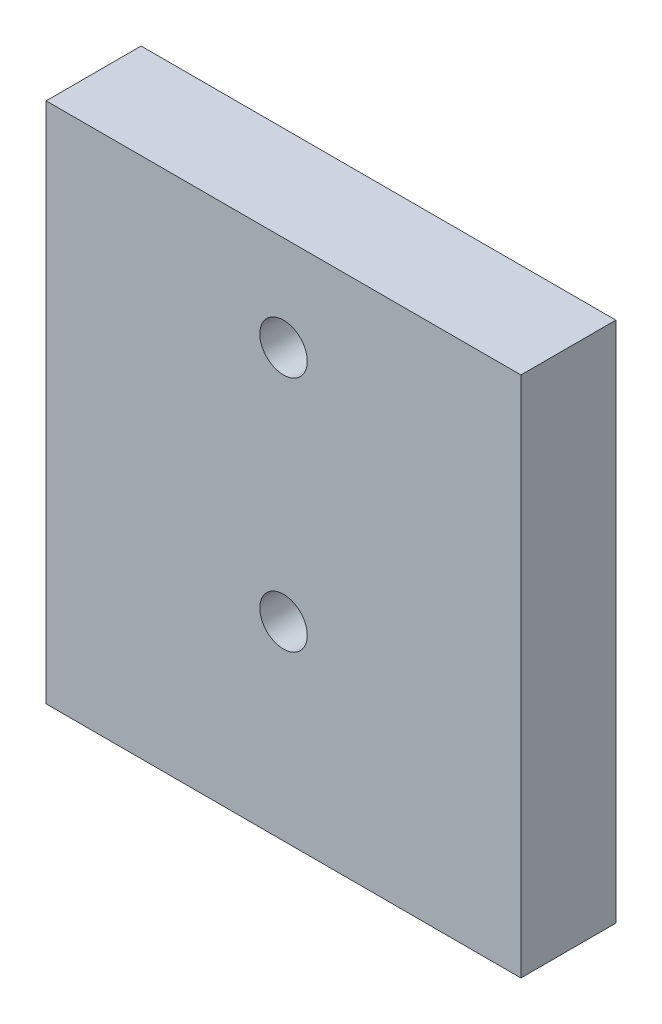
ISO-10303-21;
HEADER;
FILE_DESCRIPTION(('STEP AP214'),'2;1');
FILE_NAME('part.step','',(''),(''),'','','');
FILE_SCHEMA(('AUTOMOTIVE_DESIGN { 1 0 10303 214 1 1 1 1 }'));
ENDSEC;
DATA;
#1=APPLICATION_CONTEXT('core data for automotive mechanical design processes');
#2=APPLICATION_PROTOCOL_DEFINITION('international standard','automotive_design',2000,#1);
#3=PRODUCT_CONTEXT('',#1,'mechanical');
#4=PRODUCT('Part','Part','',(#3));
#5=PRODUCT_RELATED_PRODUCT_CATEGORY('part','',(#4));
#6=PRODUCT_DEFINITION_FORMATION('','',#4);
#7=PRODUCT_DEFINITION_CONTEXT('part definition',#1,'design');
#8=PRODUCT_DEFINITION('design','',#6,#7);
#9=PRODUCT_DEFINITION_SHAPE('','',#8);
#10=(LENGTH_UNIT() NAMED_UNIT(*) SI_UNIT(.MILLI.,.METRE.));
#11=(NAMED_UNIT(*) PLANE_ANGLE_UNIT() SI_UNIT($,.RADIAN.));
#12=(NAMED_UNIT(*) SI_UNIT($,.STERADIAN.) SOLID_ANGLE_UNIT());
#13=UNCERTAINTY_MEASURE_WITH_UNIT(LENGTH_MEASURE(1.E-05),#10,'distance_accuracy_value','');
#14=(GEOMETRIC_REPRESENTATION_CONTEXT(3) GLOBAL_UNCERTAINTY_ASSIGNED_CONTEXT((#13)) GLOBAL_UNIT_ASSIGNED_CONTEXT((#10,
#11,#12)) REPRESENTATION_CONTEXT('',''));
#15=CARTESIAN_POINT('',(0.,0.,0.));
#16=DIRECTION('',(0.,0.,1.));
#17=DIRECTION('',(1.,0.,0.));
#18=AXIS2_PLACEMENT_3D('',#15,#16,#17);
#19=CARTESIAN_POINT('',(0.,0.,6.));
#20=DIRECTION('',(0.,0.,1.));
#21=DIRECTION('',(1.,0.,0.));
#22=AXIS2_PLACEMENT_3D('',#19,#20,#21);
#23=PLANE('',#22);
#24=CARTESIAN_POINT('',(0.,0.,6.));
#25=DIRECTION('',(0.,0.,1.));
#26=DIRECTION('',(1.,0.,0.));
#27=AXIS2_PLACEMENT_3D('',#24,#25,#26);
#28=CIRCLE('',#27,1.5);
#29=CARTESIAN_POINT('',(1.5,0.,6.));
#30=VERTEX_POINT('',#29);
#31=EDGE_CURVE('E118',#30,#30,#28,.T.);
#32=ORIENTED_EDGE('',*,*,#31,.F.);
#33=EDGE_LOOP('',(#32));
#34=FACE_BOUND('',#33,.T.);
#35=DIRECTION('',(-1.,0.,0.));
#36=VECTOR('',#35,1.);
#37=CARTESIAN_POINT('',(15.,21.,6.));
#38=LINE('',#37,#36);
#39=CARTESIAN_POINT('',(15.,21.,6.));
#40=VERTEX_POINT('',#39);
#41=CARTESIAN_POINT('',(-15.,21.,6.));
#42=VERTEX_POINT('',#41);
#43=EDGE_CURVE('E90',#40,#42,#38,.T.);
#44=ORIENTED_EDGE('',*,*,#43,.T.);
#45=DIRECTION('',(0.,-1.,0.));
#46=VECTOR('',#45,1.);
#47=CARTESIAN_POINT('',(-15.,21.,6.));
#48=LINE('',#47,#46);
#49=CARTESIAN_POINT('',(-15.,-12.,6.));
#50=VERTEX_POINT('',#49);
#51=EDGE_CURVE('E85',#42,#50,#48,.T.);
#52=ORIENTED_EDGE('',*,*,#51,.T.);
#53=DIRECTION('',(1.,0.,0.));
#54=VECTOR('',#53,1.);
#55=CARTESIAN_POINT('',(-15.,-12.,6.));
#56=LINE('',#55,#54);
#57=CARTESIAN_POINT('',(15.,-12.,6.));
#58=VERTEX_POINT('',#57);
#59=EDGE_CURVE('E88',#50,#58,#56,.T.);
#60=ORIENTED_EDGE('',*,*,#59,.T.);
#61=DIRECTION('',(0.,1.,0.));
#62=VECTOR('',#61,1.);
#63=CARTESIAN_POINT('',(15.,-12.,6.));
#64=LINE('',#63,#62);
#65=EDGE_CURVE('E55',#58,#40,#64,.T.);
#66=ORIENTED_EDGE('',*,*,#65,.T.);
#67=EDGE_LOOP('',(#44,#52,#60,#66));
#68=FACE_BOUND('',#67,.T.);
#69=CARTESIAN_POINT('',(0.,15.,6.));
#70=DIRECTION('',(0.,0.,1.));
#71=DIRECTION('',(1.,0.,0.));
#72=AXIS2_PLACEMENT_3D('',#69,#70,#71);
#73=CIRCLE('',#72,1.5);
#74=CARTESIAN_POINT('',(1.5,15.,6.));
#75=VERTEX_POINT('',#74);
#76=EDGE_CURVE('E119',#75,#75,#73,.T.);
#77=ORIENTED_EDGE('',*,*,#76,.F.);
#78=EDGE_LOOP('',(#77));
#79=FACE_BOUND('',#78,.T.);
#80=ADVANCED_FACE('F38',(#34,#68,#79),#23,.T.);
#81=CARTESIAN_POINT('',(0.,0.,0.));
#82=DIRECTION('',(0.,0.,1.));
#83=DIRECTION('',(1.,0.,0.));
#84=AXIS2_PLACEMENT_3D('',#81,#82,#83);
#85=PLANE('',#84);
#86=DIRECTION('',(-1.,0.,0.));
#87=VECTOR('',#86,1.);
#88=CARTESIAN_POINT('',(15.,21.,0.));
#89=LINE('',#88,#87);
#90=CARTESIAN_POINT('',(15.,21.,0.));
#91=VERTEX_POINT('',#90);
#92=CARTESIAN_POINT('',(-15.,21.,0.));
#93=VERTEX_POINT('',#92);
#94=EDGE_CURVE('E124',#91,#93,#89,.T.);
#95=ORIENTED_EDGE('',*,*,#94,.F.);
#96=DIRECTION('',(0.,1.,0.));
#97=VECTOR('',#96,1.);
#98=CARTESIAN_POINT('',(15.,-12.,0.));
#99=LINE('',#98,#97);
#100=CARTESIAN_POINT('',(15.,-12.,0.));
#101=VERTEX_POINT('',#100);
#102=EDGE_CURVE('E78',#101,#91,#99,.T.);
#103=ORIENTED_EDGE('',*,*,#102,.F.);
#104=DIRECTION('',(1.,0.,0.));
#105=VECTOR('',#104,1.);
#106=CARTESIAN_POINT('',(-15.,-12.,0.));
#107=LINE('',#106,#105);
#108=CARTESIAN_POINT('',(-15.,-12.,0.));
#109=VERTEX_POINT('',#108);
#110=EDGE_CURVE('E72',#109,#101,#107,.T.);
#111=ORIENTED_EDGE('',*,*,#110,.F.);
#112=DIRECTION('',(0.,-1.,0.));
#113=VECTOR('',#112,1.);
#114=CARTESIAN_POINT('',(-15.,21.,0.));
#115=LINE('',#114,#113);
#116=EDGE_CURVE('E95',#93,#109,#115,.T.);
#117=ORIENTED_EDGE('',*,*,#116,.F.);
#118=EDGE_LOOP('',(#95,#103,#111,#117));
#119=FACE_BOUND('',#118,.T.);
#120=CARTESIAN_POINT('',(0.,0.,0.));
#121=DIRECTION('',(0.,0.,1.));
#122=DIRECTION('',(1.,0.,0.));
#123=AXIS2_PLACEMENT_3D('',#120,#121,#122);
#124=CIRCLE('',#123,1.5);
#125=CARTESIAN_POINT('',(1.5,0.,0.));
#126=VERTEX_POINT('',#125);
#127=EDGE_CURVE('E116',#126,#126,#124,.T.);
#128=ORIENTED_EDGE('',*,*,#127,.T.);
#129=EDGE_LOOP('',(#128));
#130=FACE_BOUND('',#129,.T.);
#131=CARTESIAN_POINT('',(0.,15.,0.));
#132=DIRECTION('',(0.,0.,1.));
#133=DIRECTION('',(1.,0.,0.));
#134=AXIS2_PLACEMENT_3D('',#131,#132,#133);
#135=CIRCLE('',#134,1.5);
#136=CARTESIAN_POINT('',(1.5,15.,0.));
#137=VERTEX_POINT('',#136);
#138=EDGE_CURVE('E125',#137,#137,#135,.T.);
#139=ORIENTED_EDGE('',*,*,#138,.T.);
#140=EDGE_LOOP('',(#139));
#141=FACE_BOUND('',#140,.T.);
#142=ADVANCED_FACE('F135',(#119,#130,#141),#85,.F.);
#143=CARTESIAN_POINT('',(15.,21.,6.));
#144=DIRECTION('',(0.,-1.,0.));
#145=DIRECTION('',(0.,0.,-1.));
#146=AXIS2_PLACEMENT_3D('',#143,#144,#145);
#147=PLANE('',#146);
#148=ORIENTED_EDGE('',*,*,#94,.T.);
#149=DIRECTION('',(0.,0.,-1.));
#150=VECTOR('',#149,1.);
#151=CARTESIAN_POINT('',(-15.,21.,6.));
#152=LINE('',#151,#150);
#153=EDGE_CURVE('E12',#42,#93,#152,.T.);
#154=ORIENTED_EDGE('',*,*,#153,.F.);
#155=ORIENTED_EDGE('',*,*,#43,.F.);
#156=DIRECTION('',(0.,0.,-1.));
#157=VECTOR('',#156,1.);
#158=CARTESIAN_POINT('',(15.,21.,6.));
#159=LINE('',#158,#157);
#160=EDGE_CURVE('E101',#40,#91,#159,.T.);
#161=ORIENTED_EDGE('',*,*,#160,.T.);
#162=EDGE_LOOP('',(#148,#154,#155,#161));
#163=FACE_BOUND('',#162,.T.);
#164=ADVANCED_FACE('F40',(#163),#147,.F.);
#165=CARTESIAN_POINT('',(-15.,21.,6.));
#166=DIRECTION('',(1.,0.,0.));
#167=DIRECTION('',(0.,0.,-1.));
#168=AXIS2_PLACEMENT_3D('',#165,#166,#167);
#169=PLANE('',#168);
#170=ORIENTED_EDGE('',*,*,#116,.T.);
#171=DIRECTION('',(0.,0.,-1.));
#172=VECTOR('',#171,1.);
#173=CARTESIAN_POINT('',(-15.,-12.,6.));
#174=LINE('',#173,#172);
#175=EDGE_CURVE('E47',#50,#109,#174,.T.);
#176=ORIENTED_EDGE('',*,*,#175,.F.);
#177=ORIENTED_EDGE('',*,*,#51,.F.);
#178=ORIENTED_EDGE('',*,*,#153,.T.);
#179=EDGE_LOOP('',(#170,#176,#177,#178));
#180=FACE_BOUND('',#179,.T.);
#181=ADVANCED_FACE('F94',(#180),#169,.F.);
#182=CARTESIAN_POINT('',(-15.,-12.,6.));
#183=DIRECTION('',(0.,1.,0.));
#184=DIRECTION('',(0.,0.,1.));
#185=AXIS2_PLACEMENT_3D('',#182,#183,#184);
#186=PLANE('',#185);
#187=ORIENTED_EDGE('',*,*,#110,.T.);
#188=DIRECTION('',(0.,0.,-1.));
#189=VECTOR('',#188,1.);
#190=CARTESIAN_POINT('',(15.,-12.,6.));
#191=LINE('',#190,#189);
#192=EDGE_CURVE('E96',#58,#101,#191,.T.);
#193=ORIENTED_EDGE('',*,*,#192,.F.);
#194=ORIENTED_EDGE('',*,*,#59,.F.);
#195=ORIENTED_EDGE('',*,*,#175,.T.);
#196=EDGE_LOOP('',(#187,#193,#194,#195));
#197=FACE_BOUND('',#196,.T.);
#198=ADVANCED_FACE('F97',(#197),#186,.F.);
#199=CARTESIAN_POINT('',(15.,-12.,6.));
#200=DIRECTION('',(-1.,0.,0.));
#201=DIRECTION('',(0.,0.,1.));
#202=AXIS2_PLACEMENT_3D('',#199,#200,#201);
#203=PLANE('',#202);
#204=ORIENTED_EDGE('',*,*,#102,.T.);
#205=ORIENTED_EDGE('',*,*,#160,.F.);
#206=ORIENTED_EDGE('',*,*,#65,.F.);
#207=ORIENTED_EDGE('',*,*,#192,.T.);
#208=EDGE_LOOP('',(#204,#205,#206,#207));
#209=FACE_BOUND('',#208,.T.);
#210=ADVANCED_FACE('F148',(#209),#203,.F.);
#211=CARTESIAN_POINT('',(0.,0.,6.));
#212=DIRECTION('',(0.,0.,-1.));
#213=DIRECTION('',(-1.,0.,0.));
#214=AXIS2_PLACEMENT_3D('',#211,#212,#213);
#215=CYLINDRICAL_SURFACE('',#214,1.5);
#216=ORIENTED_EDGE('',*,*,#31,.T.);
#217=EDGE_LOOP('',(#216));
#218=FACE_BOUND('',#217,.T.);
#219=ORIENTED_EDGE('',*,*,#127,.F.);
#220=EDGE_LOOP('',(#219));
#221=FACE_BOUND('',#220,.T.);
#222=ADVANCED_FACE('F145',(#218,#221),#215,.F.);
#223=CARTESIAN_POINT('',(0.,15.,6.));
#224=DIRECTION('',(0.,0.,-1.));
#225=DIRECTION('',(-1.,0.,0.));
#226=AXIS2_PLACEMENT_3D('',#223,#224,#225);
#227=CYLINDRICAL_SURFACE('',#226,1.5);
#228=ORIENTED_EDGE('',*,*,#76,.T.);
#229=EDGE_LOOP('',(#228));
#230=FACE_BOUND('',#229,.T.);
#231=ORIENTED_EDGE('',*,*,#138,.F.);
#232=EDGE_LOOP('',(#231));
#233=FACE_BOUND('',#232,.T.);
#234=ADVANCED_FACE('F132',(#230,#233),#227,.F.);
#235=CLOSED_SHELL('',(#80,#142,#164,#181,#198,#210,#222,#234));
#236=MANIFOLD_SOLID_BREP('B2',#235);
#237=ADVANCED_BREP_SHAPE_REPRESENTATION('',(#18,#236),#14);
#238=SHAPE_DEFINITION_REPRESENTATION(#9,#237);
ENDSEC;
END-ISO-10303-21;
